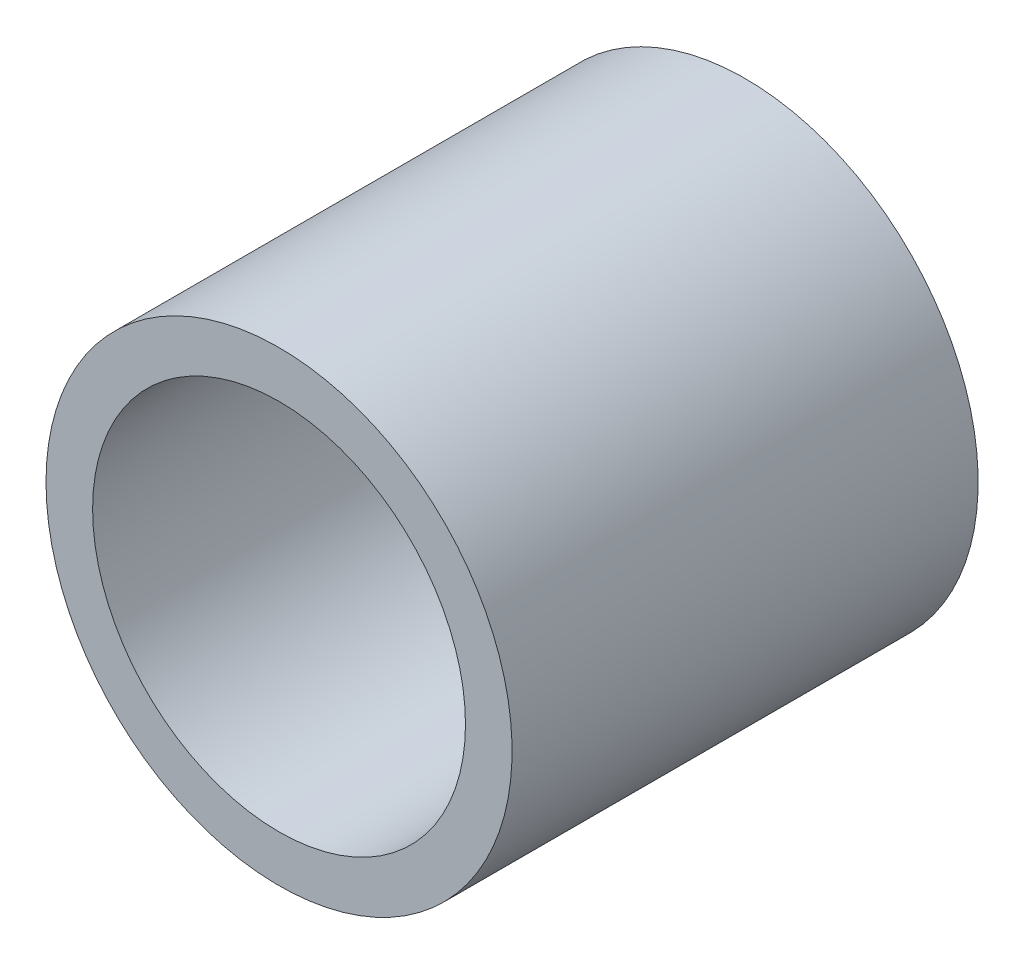
ISO-10303-21;
HEADER;
FILE_DESCRIPTION(('STEP AP214'),'2;1');
FILE_NAME('part.step','',(''),(''),'','','');
FILE_SCHEMA(('AUTOMOTIVE_DESIGN { 1 0 10303 214 1 1 1 1 }'));
ENDSEC;
DATA;
#1=APPLICATION_CONTEXT('core data for automotive mechanical design processes');
#2=APPLICATION_PROTOCOL_DEFINITION('international standard','automotive_design',2000,#1);
#3=PRODUCT_CONTEXT('',#1,'mechanical');
#4=PRODUCT('Part','Part','',(#3));
#5=PRODUCT_RELATED_PRODUCT_CATEGORY('part','',(#4));
#6=PRODUCT_DEFINITION_FORMATION('','',#4);
#7=PRODUCT_DEFINITION_CONTEXT('part definition',#1,'design');
#8=PRODUCT_DEFINITION('design','',#6,#7);
#9=PRODUCT_DEFINITION_SHAPE('','',#8);
#10=(LENGTH_UNIT() NAMED_UNIT(*) SI_UNIT(.MILLI.,.METRE.));
#11=(NAMED_UNIT(*) PLANE_ANGLE_UNIT() SI_UNIT($,.RADIAN.));
#12=(NAMED_UNIT(*) SI_UNIT($,.STERADIAN.) SOLID_ANGLE_UNIT());
#13=UNCERTAINTY_MEASURE_WITH_UNIT(LENGTH_MEASURE(1.E-05),#10,'distance_accuracy_value','');
#14=(GEOMETRIC_REPRESENTATION_CONTEXT(3) GLOBAL_UNCERTAINTY_ASSIGNED_CONTEXT((#13)) GLOBAL_UNIT_ASSIGNED_CONTEXT((#10,
#11,#12)) REPRESENTATION_CONTEXT('',''));
#15=CARTESIAN_POINT('',(0.,0.,0.));
#16=DIRECTION('',(0.,0.,1.));
#17=DIRECTION('',(1.,0.,0.));
#18=AXIS2_PLACEMENT_3D('',#15,#16,#17);
#19=CARTESIAN_POINT('',(-10.4383519369389,10.1046106987952,20.));
#20=DIRECTION('',(0.,0.,1.));
#21=DIRECTION('',(1.,0.,0.));
#22=AXIS2_PLACEMENT_3D('',#19,#20,#21);
#23=PLANE('',#22);
#24=CARTESIAN_POINT('',(-10.4383519369389,10.1046106987952,20.));
#25=DIRECTION('',(0.,0.,1.));
#26=DIRECTION('',(1.,0.,0.));
#27=AXIS2_PLACEMENT_3D('',#24,#25,#26);
#28=CIRCLE('',#27,10.);
#29=CARTESIAN_POINT('',(-20.4383519369389,10.1046106987952,20.));
#30=VERTEX_POINT('',#29);
#31=EDGE_CURVE('E10',#30,#30,#28,.T.);
#32=ORIENTED_EDGE('',*,*,#31,.T.);
#33=EDGE_LOOP('',(#32));
#34=FACE_BOUND('',#33,.T.);
#35=CARTESIAN_POINT('',(-10.4383519369389,10.1046106987952,20.));
#36=DIRECTION('',(0.,0.,1.));
#37=DIRECTION('',(1.,0.,0.));
#38=AXIS2_PLACEMENT_3D('',#35,#36,#37);
#39=CIRCLE('',#38,8.);
#40=CARTESIAN_POINT('',(-18.4383519369389,10.1046106987952,20.));
#41=VERTEX_POINT('',#40);
#42=EDGE_CURVE('E42',#41,#41,#39,.T.);
#43=ORIENTED_EDGE('',*,*,#42,.F.);
#44=EDGE_LOOP('',(#43));
#45=FACE_BOUND('',#44,.T.);
#46=ADVANCED_FACE('F31',(#34,#45),#23,.T.);
#47=CARTESIAN_POINT('',(-10.4383519369389,10.1046106987952,0.));
#48=DIRECTION('',(0.,0.,1.));
#49=DIRECTION('',(1.,0.,0.));
#50=AXIS2_PLACEMENT_3D('',#47,#48,#49);
#51=PLANE('',#50);
#52=CARTESIAN_POINT('',(-10.4383519369389,10.1046106987952,0.));
#53=DIRECTION('',(0.,0.,1.));
#54=DIRECTION('',(1.,0.,0.));
#55=AXIS2_PLACEMENT_3D('',#52,#53,#54);
#56=CIRCLE('',#55,10.);
#57=CARTESIAN_POINT('',(-20.4383519369389,10.1046106987952,0.));
#58=VERTEX_POINT('',#57);
#59=EDGE_CURVE('E35',#58,#58,#56,.T.);
#60=ORIENTED_EDGE('',*,*,#59,.F.);
#61=EDGE_LOOP('',(#60));
#62=FACE_BOUND('',#61,.T.);
#63=CARTESIAN_POINT('',(-10.4383519369389,10.1046106987952,0.));
#64=DIRECTION('',(0.,0.,1.));
#65=DIRECTION('',(1.,0.,0.));
#66=AXIS2_PLACEMENT_3D('',#63,#64,#65);
#67=CIRCLE('',#66,8.);
#68=CARTESIAN_POINT('',(-18.4383519369389,10.1046106987952,0.));
#69=VERTEX_POINT('',#68);
#70=EDGE_CURVE('E44',#69,#69,#67,.T.);
#71=ORIENTED_EDGE('',*,*,#70,.T.);
#72=EDGE_LOOP('',(#71));
#73=FACE_BOUND('',#72,.T.);
#74=ADVANCED_FACE('F54',(#62,#73),#51,.F.);
#75=CARTESIAN_POINT('',(-10.4383519369389,10.1046106987952,20.));
#76=DIRECTION('',(0.,0.,-1.));
#77=DIRECTION('',(-1.,0.,0.));
#78=AXIS2_PLACEMENT_3D('',#75,#76,#77);
#79=CYLINDRICAL_SURFACE('',#78,10.);
#80=CARTESIAN_POINT('',(-20.4383519369389,10.1046106987952,20.));
#81=CARTESIAN_POINT('',(-20.4383519369389,10.1046106987952,19.7916666666667));
#82=CARTESIAN_POINT('',(-20.4383519369389,10.1046106987952,19.5833333333333));
#83=CARTESIAN_POINT('',(-20.4383519369389,10.1046106987952,19.1666666666667));
#84=CARTESIAN_POINT('',(-20.4383519369389,10.1046106987952,18.9583333333333));
#85=CARTESIAN_POINT('',(-20.4383519369389,10.1046106987952,18.5416666666667));
#86=CARTESIAN_POINT('',(-20.4383519369389,10.1046106987952,18.3333333333333));
#87=CARTESIAN_POINT('',(-20.4383519369389,10.1046106987952,17.9166666666667));
#88=CARTESIAN_POINT('',(-20.4383519369389,10.1046106987952,17.7083333333333));
#89=CARTESIAN_POINT('',(-20.4383519369389,10.1046106987952,17.2916666666667));
#90=CARTESIAN_POINT('',(-20.4383519369389,10.1046106987952,17.0833333333333));
#91=CARTESIAN_POINT('',(-20.4383519369389,10.1046106987952,16.6666666666667));
#92=CARTESIAN_POINT('',(-20.4383519369389,10.1046106987952,16.4583333333333));
#93=CARTESIAN_POINT('',(-20.4383519369389,10.1046106987952,16.0416666666667));
#94=CARTESIAN_POINT('',(-20.4383519369389,10.1046106987952,15.8333333333333));
#95=CARTESIAN_POINT('',(-20.4383519369389,10.1046106987952,15.4166666666667));
#96=CARTESIAN_POINT('',(-20.4383519369389,10.1046106987952,15.2083333333333));
#97=CARTESIAN_POINT('',(-20.4383519369389,10.1046106987952,14.7916666666667));
#98=CARTESIAN_POINT('',(-20.4383519369389,10.1046106987952,14.5833333333333));
#99=CARTESIAN_POINT('',(-20.4383519369389,10.1046106987952,14.1666666666667));
#100=CARTESIAN_POINT('',(-20.4383519369389,10.1046106987952,13.9583333333333));
#101=CARTESIAN_POINT('',(-20.4383519369389,10.1046106987952,13.5416666666667));
#102=CARTESIAN_POINT('',(-20.4383519369389,10.1046106987952,13.3333333333333));
#103=CARTESIAN_POINT('',(-20.4383519369389,10.1046106987952,12.9166666666667));
#104=CARTESIAN_POINT('',(-20.4383519369389,10.1046106987952,12.7083333333333));
#105=CARTESIAN_POINT('',(-20.4383519369389,10.1046106987952,12.2916666666667));
#106=CARTESIAN_POINT('',(-20.4383519369389,10.1046106987952,12.0833333333333));
#107=CARTESIAN_POINT('',(-20.4383519369389,10.1046106987952,11.6666666666667));
#108=CARTESIAN_POINT('',(-20.4383519369389,10.1046106987952,11.4583333333333));
#109=CARTESIAN_POINT('',(-20.4383519369389,10.1046106987952,11.0416666666667));
#110=CARTESIAN_POINT('',(-20.4383519369389,10.1046106987952,10.8333333333333));
#111=CARTESIAN_POINT('',(-20.4383519369389,10.1046106987952,10.4166666666667));
#112=CARTESIAN_POINT('',(-20.4383519369389,10.1046106987952,10.2083333333333));
#113=CARTESIAN_POINT('',(-20.4383519369389,10.1046106987952,9.79166666666667));
#114=CARTESIAN_POINT('',(-20.4383519369389,10.1046106987952,9.58333333333333));
#115=CARTESIAN_POINT('',(-20.4383519369389,10.1046106987952,9.16666666666667));
#116=CARTESIAN_POINT('',(-20.4383519369389,10.1046106987952,8.95833333333333));
#117=CARTESIAN_POINT('',(-20.4383519369389,10.1046106987952,8.54166666666667));
#118=CARTESIAN_POINT('',(-20.4383519369389,10.1046106987952,8.33333333333333));
#119=CARTESIAN_POINT('',(-20.4383519369389,10.1046106987952,7.91666666666667));
#120=CARTESIAN_POINT('',(-20.4383519369389,10.1046106987952,7.70833333333333));
#121=CARTESIAN_POINT('',(-20.4383519369389,10.1046106987952,7.29166666666667));
#122=CARTESIAN_POINT('',(-20.4383519369389,10.1046106987952,7.08333333333333));
#123=CARTESIAN_POINT('',(-20.4383519369389,10.1046106987952,6.66666666666667));
#124=CARTESIAN_POINT('',(-20.4383519369389,10.1046106987952,6.45833333333333));
#125=CARTESIAN_POINT('',(-20.4383519369389,10.1046106987952,6.04166666666667));
#126=CARTESIAN_POINT('',(-20.4383519369389,10.1046106987952,5.83333333333333));
#127=CARTESIAN_POINT('',(-20.4383519369389,10.1046106987952,5.41666666666667));
#128=CARTESIAN_POINT('',(-20.4383519369389,10.1046106987952,5.20833333333333));
#129=CARTESIAN_POINT('',(-20.4383519369389,10.1046106987952,4.79166666666667));
#130=CARTESIAN_POINT('',(-20.4383519369389,10.1046106987952,4.58333333333334));
#131=CARTESIAN_POINT('',(-20.4383519369389,10.1046106987952,4.16666666666667));
#132=CARTESIAN_POINT('',(-20.4383519369389,10.1046106987952,3.95833333333334));
#133=CARTESIAN_POINT('',(-20.4383519369389,10.1046106987952,3.54166666666667));
#134=CARTESIAN_POINT('',(-20.4383519369389,10.1046106987952,3.33333333333334));
#135=CARTESIAN_POINT('',(-20.4383519369389,10.1046106987952,2.91666666666667));
#136=CARTESIAN_POINT('',(-20.4383519369389,10.1046106987952,2.70833333333334));
#137=CARTESIAN_POINT('',(-20.4383519369389,10.1046106987952,2.29166666666667));
#138=CARTESIAN_POINT('',(-20.4383519369389,10.1046106987952,2.08333333333334));
#139=CARTESIAN_POINT('',(-20.4383519369389,10.1046106987952,1.66666666666667));
#140=CARTESIAN_POINT('',(-20.4383519369389,10.1046106987952,1.45833333333333));
#141=CARTESIAN_POINT('',(-20.4383519369389,10.1046106987952,1.04166666666667));
#142=CARTESIAN_POINT('',(-20.4383519369389,10.1046106987952,0.833333333333334));
#143=CARTESIAN_POINT('',(-20.4383519369389,10.1046106987952,0.416666666666667));
#144=CARTESIAN_POINT('',(-20.4383519369389,10.1046106987952,0.208333333333334));
#145=CARTESIAN_POINT('',(-20.4383519369389,10.1046106987952,0.));
#146=B_SPLINE_CURVE_WITH_KNOTS('',3,(#80,#81,#82,#83,#84,#85,#86,#87,#88,#89,#90,#91,#92,#93,
#94,#95,#96,#97,#98,#99,#100,#101,#102,#103,#104,#105,#106,#107,#108,#109,#110,#111,#112,#113,
#114,#115,#116,#117,#118,#119,#120,#121,#122,#123,#124,#125,#126,#127,#128,#129,#130,#131,#132,
#133,#134,#135,#136,#137,#138,#139,#140,#141,#142,#143,#144,#145),.UNSPECIFIED.,.F.,.F.,(4,2,2,
2,2,2,2,2,2,2,2,2,2,2,2,2,2,2,2,2,2,2,2,2,2,2,2,2,2,2,2,2,4),(0.,0.625000000000001,1.25,1.875,
2.5,3.125,3.75,4.375,5.,5.62500000000001,6.25000000000001,6.875,7.50000000000001,8.125,8.75,
9.37500000000001,10.,10.625,11.25,11.875,12.5,13.125,13.75,14.375,15.,15.625,16.25,16.875,17.5,
18.125,18.75,19.375,20.),.UNSPECIFIED.);
#147=EDGE_CURVE('BSEAM33',#30,#58,#146,.T.);
#148=ORIENTED_EDGE('',*,*,#31,.F.);
#149=ORIENTED_EDGE('',*,*,#59,.T.);
#150=ORIENTED_EDGE('',*,*,#147,.T.);
#151=ORIENTED_EDGE('',*,*,#147,.F.);
#152=EDGE_LOOP('',(#148,#150,#149,#151));
#153=FACE_BOUND('',#152,.T.);
#154=ADVANCED_FACE('F33',(#153),#79,.T.);
#155=CARTESIAN_POINT('',(-10.4383519369389,10.1046106987952,20.));
#156=DIRECTION('',(0.,0.,-1.));
#157=DIRECTION('',(-1.,0.,0.));
#158=AXIS2_PLACEMENT_3D('',#155,#156,#157);
#159=CYLINDRICAL_SURFACE('',#158,8.);
#160=CARTESIAN_POINT('',(-18.4383519369389,10.1046106987952,20.));
#161=CARTESIAN_POINT('',(-18.4383519369389,10.1046106987952,19.7916666666667));
#162=CARTESIAN_POINT('',(-18.4383519369389,10.1046106987952,19.5833333333333));
#163=CARTESIAN_POINT('',(-18.4383519369389,10.1046106987952,19.1666666666667));
#164=CARTESIAN_POINT('',(-18.4383519369389,10.1046106987952,18.9583333333333));
#165=CARTESIAN_POINT('',(-18.4383519369389,10.1046106987952,18.5416666666667));
#166=CARTESIAN_POINT('',(-18.4383519369389,10.1046106987952,18.3333333333333));
#167=CARTESIAN_POINT('',(-18.4383519369389,10.1046106987952,17.9166666666667));
#168=CARTESIAN_POINT('',(-18.4383519369389,10.1046106987952,17.7083333333333));
#169=CARTESIAN_POINT('',(-18.4383519369389,10.1046106987952,17.2916666666667));
#170=CARTESIAN_POINT('',(-18.4383519369389,10.1046106987952,17.0833333333333));
#171=CARTESIAN_POINT('',(-18.4383519369389,10.1046106987952,16.6666666666667));
#172=CARTESIAN_POINT('',(-18.4383519369389,10.1046106987952,16.4583333333333));
#173=CARTESIAN_POINT('',(-18.4383519369389,10.1046106987952,16.0416666666667));
#174=CARTESIAN_POINT('',(-18.4383519369389,10.1046106987952,15.8333333333333));
#175=CARTESIAN_POINT('',(-18.4383519369389,10.1046106987952,15.4166666666667));
#176=CARTESIAN_POINT('',(-18.4383519369389,10.1046106987952,15.2083333333333));
#177=CARTESIAN_POINT('',(-18.4383519369389,10.1046106987952,14.7916666666667));
#178=CARTESIAN_POINT('',(-18.4383519369389,10.1046106987952,14.5833333333333));
#179=CARTESIAN_POINT('',(-18.4383519369389,10.1046106987952,14.1666666666667));
#180=CARTESIAN_POINT('',(-18.4383519369389,10.1046106987952,13.9583333333333));
#181=CARTESIAN_POINT('',(-18.4383519369389,10.1046106987952,13.5416666666667));
#182=CARTESIAN_POINT('',(-18.4383519369389,10.1046106987952,13.3333333333333));
#183=CARTESIAN_POINT('',(-18.4383519369389,10.1046106987952,12.9166666666667));
#184=CARTESIAN_POINT('',(-18.4383519369389,10.1046106987952,12.7083333333333));
#185=CARTESIAN_POINT('',(-18.4383519369389,10.1046106987952,12.2916666666667));
#186=CARTESIAN_POINT('',(-18.4383519369389,10.1046106987952,12.0833333333333));
#187=CARTESIAN_POINT('',(-18.4383519369389,10.1046106987952,11.6666666666667));
#188=CARTESIAN_POINT('',(-18.4383519369389,10.1046106987952,11.4583333333333));
#189=CARTESIAN_POINT('',(-18.4383519369389,10.1046106987952,11.0416666666667));
#190=CARTESIAN_POINT('',(-18.4383519369389,10.1046106987952,10.8333333333333));
#191=CARTESIAN_POINT('',(-18.4383519369389,10.1046106987952,10.4166666666667));
#192=CARTESIAN_POINT('',(-18.4383519369389,10.1046106987952,10.2083333333333));
#193=CARTESIAN_POINT('',(-18.4383519369389,10.1046106987952,9.79166666666667));
#194=CARTESIAN_POINT('',(-18.4383519369389,10.1046106987952,9.58333333333334));
#195=CARTESIAN_POINT('',(-18.4383519369389,10.1046106987952,9.16666666666667));
#196=CARTESIAN_POINT('',(-18.4383519369389,10.1046106987952,8.95833333333334));
#197=CARTESIAN_POINT('',(-18.4383519369389,10.1046106987952,8.54166666666667));
#198=CARTESIAN_POINT('',(-18.4383519369389,10.1046106987952,8.33333333333334));
#199=CARTESIAN_POINT('',(-18.4383519369389,10.1046106987952,7.91666666666667));
#200=CARTESIAN_POINT('',(-18.4383519369389,10.1046106987952,7.70833333333334));
#201=CARTESIAN_POINT('',(-18.4383519369389,10.1046106987952,7.29166666666667));
#202=CARTESIAN_POINT('',(-18.4383519369389,10.1046106987952,7.08333333333334));
#203=CARTESIAN_POINT('',(-18.4383519369389,10.1046106987952,6.66666666666667));
#204=CARTESIAN_POINT('',(-18.4383519369389,10.1046106987952,6.45833333333334));
#205=CARTESIAN_POINT('',(-18.4383519369389,10.1046106987952,6.04166666666667));
#206=CARTESIAN_POINT('',(-18.4383519369389,10.1046106987952,5.83333333333334));
#207=CARTESIAN_POINT('',(-18.4383519369389,10.1046106987952,5.41666666666667));
#208=CARTESIAN_POINT('',(-18.4383519369389,10.1046106987952,5.20833333333333));
#209=CARTESIAN_POINT('',(-18.4383519369389,10.1046106987952,4.79166666666667));
#210=CARTESIAN_POINT('',(-18.4383519369389,10.1046106987952,4.58333333333333));
#211=CARTESIAN_POINT('',(-18.4383519369389,10.1046106987952,4.16666666666667));
#212=CARTESIAN_POINT('',(-18.4383519369389,10.1046106987952,3.95833333333333));
#213=CARTESIAN_POINT('',(-18.4383519369389,10.1046106987952,3.54166666666667));
#214=CARTESIAN_POINT('',(-18.4383519369389,10.1046106987952,3.33333333333334));
#215=CARTESIAN_POINT('',(-18.4383519369389,10.1046106987952,2.91666666666667));
#216=CARTESIAN_POINT('',(-18.4383519369389,10.1046106987952,2.70833333333334));
#217=CARTESIAN_POINT('',(-18.4383519369389,10.1046106987952,2.29166666666667));
#218=CARTESIAN_POINT('',(-18.4383519369389,10.1046106987952,2.08333333333334));
#219=CARTESIAN_POINT('',(-18.4383519369389,10.1046106987952,1.66666666666667));
#220=CARTESIAN_POINT('',(-18.4383519369389,10.1046106987952,1.45833333333333));
#221=CARTESIAN_POINT('',(-18.4383519369389,10.1046106987952,1.04166666666667));
#222=CARTESIAN_POINT('',(-18.4383519369389,10.1046106987952,0.833333333333334));
#223=CARTESIAN_POINT('',(-18.4383519369389,10.1046106987952,0.416666666666667));
#224=CARTESIAN_POINT('',(-18.4383519369389,10.1046106987952,0.208333333333334));
#225=CARTESIAN_POINT('',(-18.4383519369389,10.1046106987952,0.));
#226=B_SPLINE_CURVE_WITH_KNOTS('',3,(#160,#161,#162,#163,#164,#165,#166,#167,#168,#169,#170,
#171,#172,#173,#174,#175,#176,#177,#178,#179,#180,#181,#182,#183,#184,#185,#186,#187,#188,#189,
#190,#191,#192,#193,#194,#195,#196,#197,#198,#199,#200,#201,#202,#203,#204,#205,#206,#207,#208,
#209,#210,#211,#212,#213,#214,#215,#216,#217,#218,#219,#220,#221,#222,#223,#224,#225),
.UNSPECIFIED.,.F.,.F.,(4,2,2,2,2,2,2,2,2,2,2,2,2,2,2,2,2,2,2,2,2,2,2,2,2,2,2,2,2,2,2,2,4),(0.,
0.624999999999997,1.25,1.875,2.5,3.125,3.75,4.375,5.,5.625,6.25,6.875,7.5,8.125,8.75,9.375,10.,
10.625,11.25,11.875,12.5,13.125,13.75,14.375,15.,15.625,16.25,16.875,17.5,18.125,18.75,19.375,
20.),.UNSPECIFIED.);
#227=EDGE_CURVE('BSEAM50',#41,#69,#226,.T.);
#228=ORIENTED_EDGE('',*,*,#42,.T.);
#229=ORIENTED_EDGE('',*,*,#70,.F.);
#230=ORIENTED_EDGE('',*,*,#227,.T.);
#231=ORIENTED_EDGE('',*,*,#227,.F.);
#232=EDGE_LOOP('',(#228,#230,#229,#231));
#233=FACE_BOUND('',#232,.T.);
#234=ADVANCED_FACE('F50',(#233),#159,.F.);
#235=CLOSED_SHELL('',(#46,#74,#154,#234));
#236=MANIFOLD_SOLID_BREP('B2',#235);
#237=ADVANCED_BREP_SHAPE_REPRESENTATION('',(#18,#236),#14);
#238=SHAPE_DEFINITION_REPRESENTATION(#9,#237);
ENDSEC;
END-ISO-10303-21;
